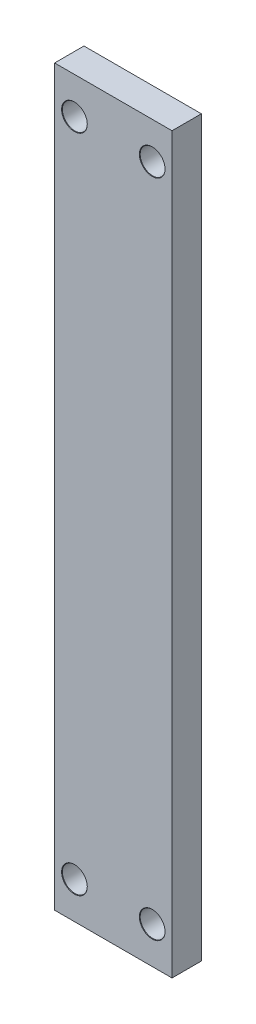
ISO-10303-21;
HEADER;
FILE_DESCRIPTION(('STEP AP214'),'2;1');
FILE_NAME('part.step','',(''),(''),'','','');
FILE_SCHEMA(('AUTOMOTIVE_DESIGN { 1 0 10303 214 1 1 1 1 }'));
ENDSEC;
DATA;
#1=APPLICATION_CONTEXT('core data for automotive mechanical design processes');
#2=APPLICATION_PROTOCOL_DEFINITION('international standard','automotive_design',2000,#1);
#3=PRODUCT_CONTEXT('',#1,'mechanical');
#4=PRODUCT('Part','Part','',(#3));
#5=PRODUCT_RELATED_PRODUCT_CATEGORY('part','',(#4));
#6=PRODUCT_DEFINITION_FORMATION('','',#4);
#7=PRODUCT_DEFINITION_CONTEXT('part definition',#1,'design');
#8=PRODUCT_DEFINITION('design','',#6,#7);
#9=PRODUCT_DEFINITION_SHAPE('','',#8);
#10=(LENGTH_UNIT() NAMED_UNIT(*) SI_UNIT(.MILLI.,.METRE.));
#11=(NAMED_UNIT(*) PLANE_ANGLE_UNIT() SI_UNIT($,.RADIAN.));
#12=(NAMED_UNIT(*) SI_UNIT($,.STERADIAN.) SOLID_ANGLE_UNIT());
#13=UNCERTAINTY_MEASURE_WITH_UNIT(LENGTH_MEASURE(1.E-05),#10,'distance_accuracy_value','');
#14=(GEOMETRIC_REPRESENTATION_CONTEXT(3) GLOBAL_UNCERTAINTY_ASSIGNED_CONTEXT((#13)) GLOBAL_UNIT_ASSIGNED_CONTEXT((#10,
#11,#12)) REPRESENTATION_CONTEXT('',''));
#15=CARTESIAN_POINT('',(0.,0.,0.));
#16=DIRECTION('',(0.,0.,1.));
#17=DIRECTION('',(1.,0.,0.));
#18=AXIS2_PLACEMENT_3D('',#15,#16,#17);
#19=CARTESIAN_POINT('',(0.,0.,2.));
#20=DIRECTION('',(1.,0.,0.));
#21=DIRECTION('',(0.,0.,-1.));
#22=AXIS2_PLACEMENT_3D('',#19,#20,#21);
#23=PLANE('',#22);
#24=DIRECTION('',(0.,-1.,0.));
#25=VECTOR('',#24,1.);
#26=CARTESIAN_POINT('',(0.,0.,0.));
#27=LINE('',#26,#25);
#28=CARTESIAN_POINT('',(0.,50.,0.));
#29=VERTEX_POINT('',#28);
#30=CARTESIAN_POINT('',(0.,0.,0.));
#31=VERTEX_POINT('',#30);
#32=EDGE_CURVE('E102',#29,#31,#27,.T.);
#33=ORIENTED_EDGE('',*,*,#32,.T.);
#34=DIRECTION('',(0.,0.,-1.));
#35=VECTOR('',#34,1.);
#36=CARTESIAN_POINT('',(0.,0.,2.));
#37=LINE('',#36,#35);
#38=CARTESIAN_POINT('',(0.,0.,2.));
#39=VERTEX_POINT('',#38);
#40=EDGE_CURVE('E11',#39,#31,#37,.T.);
#41=ORIENTED_EDGE('',*,*,#40,.F.);
#42=DIRECTION('',(0.,-1.,0.));
#43=VECTOR('',#42,1.);
#44=CARTESIAN_POINT('',(0.,0.,2.));
#45=LINE('',#44,#43);
#46=CARTESIAN_POINT('',(0.,50.,2.));
#47=VERTEX_POINT('',#46);
#48=EDGE_CURVE('E90',#47,#39,#45,.T.);
#49=ORIENTED_EDGE('',*,*,#48,.F.);
#50=DIRECTION('',(0.,0.,-1.));
#51=VECTOR('',#50,1.);
#52=CARTESIAN_POINT('',(0.,50.,2.));
#53=LINE('',#52,#51);
#54=EDGE_CURVE('E98',#47,#29,#53,.T.);
#55=ORIENTED_EDGE('',*,*,#54,.T.);
#56=EDGE_LOOP('',(#33,#41,#49,#55));
#57=FACE_BOUND('',#56,.T.);
#58=ADVANCED_FACE('F39',(#57),#23,.F.);
#59=CARTESIAN_POINT('',(0.,0.,2.));
#60=DIRECTION('',(0.,1.,0.));
#61=DIRECTION('',(0.,0.,1.));
#62=AXIS2_PLACEMENT_3D('',#59,#60,#61);
#63=PLANE('',#62);
#64=DIRECTION('',(1.,0.,0.));
#65=VECTOR('',#64,1.);
#66=CARTESIAN_POINT('',(0.,0.,0.));
#67=LINE('',#66,#65);
#68=CARTESIAN_POINT('',(8.,0.,0.));
#69=VERTEX_POINT('',#68);
#70=EDGE_CURVE('E94',#31,#69,#67,.T.);
#71=ORIENTED_EDGE('',*,*,#70,.T.);
#72=DIRECTION('',(0.,0.,-1.));
#73=VECTOR('',#72,1.);
#74=CARTESIAN_POINT('',(8.,0.,2.));
#75=LINE('',#74,#73);
#76=CARTESIAN_POINT('',(8.,0.,2.));
#77=VERTEX_POINT('',#76);
#78=EDGE_CURVE('E47',#77,#69,#75,.T.);
#79=ORIENTED_EDGE('',*,*,#78,.F.);
#80=DIRECTION('',(1.,0.,0.));
#81=VECTOR('',#80,1.);
#82=CARTESIAN_POINT('',(0.,0.,2.));
#83=LINE('',#82,#81);
#84=EDGE_CURVE('E85',#39,#77,#83,.T.);
#85=ORIENTED_EDGE('',*,*,#84,.F.);
#86=ORIENTED_EDGE('',*,*,#40,.T.);
#87=EDGE_LOOP('',(#71,#79,#85,#86));
#88=FACE_BOUND('',#87,.T.);
#89=ADVANCED_FACE('F93',(#88),#63,.F.);
#90=CARTESIAN_POINT('',(8.,0.,2.));
#91=DIRECTION('',(-1.,0.,0.));
#92=DIRECTION('',(0.,0.,1.));
#93=AXIS2_PLACEMENT_3D('',#90,#91,#92);
#94=PLANE('',#93);
#95=DIRECTION('',(0.,1.,0.));
#96=VECTOR('',#95,1.);
#97=CARTESIAN_POINT('',(8.,0.,0.));
#98=LINE('',#97,#96);
#99=CARTESIAN_POINT('',(8.,50.,0.));
#100=VERTEX_POINT('',#99);
#101=EDGE_CURVE('E72',#69,#100,#98,.T.);
#102=ORIENTED_EDGE('',*,*,#101,.T.);
#103=DIRECTION('',(0.,0.,-1.));
#104=VECTOR('',#103,1.);
#105=CARTESIAN_POINT('',(8.,50.,2.));
#106=LINE('',#105,#104);
#107=CARTESIAN_POINT('',(8.,50.,2.));
#108=VERTEX_POINT('',#107);
#109=EDGE_CURVE('E95',#108,#100,#106,.T.);
#110=ORIENTED_EDGE('',*,*,#109,.F.);
#111=DIRECTION('',(0.,1.,0.));
#112=VECTOR('',#111,1.);
#113=CARTESIAN_POINT('',(8.,0.,2.));
#114=LINE('',#113,#112);
#115=EDGE_CURVE('E88',#77,#108,#114,.T.);
#116=ORIENTED_EDGE('',*,*,#115,.F.);
#117=ORIENTED_EDGE('',*,*,#78,.T.);
#118=EDGE_LOOP('',(#102,#110,#116,#117));
#119=FACE_BOUND('',#118,.T.);
#120=ADVANCED_FACE('F96',(#119),#94,.F.);
#121=CARTESIAN_POINT('',(0.,50.,2.));
#122=DIRECTION('',(0.,-1.,0.));
#123=DIRECTION('',(0.,0.,-1.));
#124=AXIS2_PLACEMENT_3D('',#121,#122,#123);
#125=PLANE('',#124);
#126=DIRECTION('',(-1.,0.,0.));
#127=VECTOR('',#126,1.);
#128=CARTESIAN_POINT('',(0.,50.,0.));
#129=LINE('',#128,#127);
#130=EDGE_CURVE('E78',#100,#29,#129,.T.);
#131=ORIENTED_EDGE('',*,*,#130,.T.);
#132=ORIENTED_EDGE('',*,*,#54,.F.);
#133=DIRECTION('',(-1.,0.,0.));
#134=VECTOR('',#133,1.);
#135=CARTESIAN_POINT('',(0.,50.,2.));
#136=LINE('',#135,#134);
#137=EDGE_CURVE('E55',#108,#47,#136,.T.);
#138=ORIENTED_EDGE('',*,*,#137,.F.);
#139=ORIENTED_EDGE('',*,*,#109,.T.);
#140=EDGE_LOOP('',(#131,#132,#138,#139));
#141=FACE_BOUND('',#140,.T.);
#142=ADVANCED_FACE('F110',(#141),#125,.F.);
#143=CARTESIAN_POINT('',(0.,0.,2.));
#144=DIRECTION('',(0.,0.,-1.));
#145=DIRECTION('',(-1.,0.,0.));
#146=AXIS2_PLACEMENT_3D('',#143,#144,#145);
#147=PLANE('',#146);
#148=CARTESIAN_POINT('',(1.35,2.5,2.));
#149=DIRECTION('',(0.,0.,1.));
#150=DIRECTION('',(1.,0.,0.));
#151=AXIS2_PLACEMENT_3D('',#148,#149,#150);
#152=CIRCLE('',#151,0.875000000000001);
#153=CARTESIAN_POINT('',(2.225,2.5,2.));
#154=VERTEX_POINT('',#153);
#155=EDGE_CURVE('E148',#154,#154,#152,.T.);
#156=ORIENTED_EDGE('',*,*,#155,.F.);
#157=EDGE_LOOP('',(#156));
#158=FACE_BOUND('',#157,.T.);
#159=CARTESIAN_POINT('',(6.65,2.5,2.));
#160=DIRECTION('',(0.,0.,1.));
#161=DIRECTION('',(1.,0.,0.));
#162=AXIS2_PLACEMENT_3D('',#159,#160,#161);
#163=CIRCLE('',#162,0.875000000000001);
#164=CARTESIAN_POINT('',(7.525,2.5,2.));
#165=VERTEX_POINT('',#164);
#166=EDGE_CURVE('E139',#165,#165,#163,.T.);
#167=ORIENTED_EDGE('',*,*,#166,.F.);
#168=EDGE_LOOP('',(#167));
#169=FACE_BOUND('',#168,.T.);
#170=CARTESIAN_POINT('',(1.35,47.5,2.));
#171=DIRECTION('',(0.,0.,1.));
#172=DIRECTION('',(1.,0.,0.));
#173=AXIS2_PLACEMENT_3D('',#170,#171,#172);
#174=CIRCLE('',#173,0.875000000000001);
#175=CARTESIAN_POINT('',(2.225,47.5,2.));
#176=VERTEX_POINT('',#175);
#177=EDGE_CURVE('E130',#176,#176,#174,.T.);
#178=ORIENTED_EDGE('',*,*,#177,.F.);
#179=EDGE_LOOP('',(#178));
#180=FACE_BOUND('',#179,.T.);
#181=CARTESIAN_POINT('',(6.65,47.5,2.));
#182=DIRECTION('',(0.,0.,1.));
#183=DIRECTION('',(1.,0.,0.));
#184=AXIS2_PLACEMENT_3D('',#181,#182,#183);
#185=CIRCLE('',#184,0.875000000000001);
#186=CARTESIAN_POINT('',(7.525,47.5,2.));
#187=VERTEX_POINT('',#186);
#188=EDGE_CURVE('E121',#187,#187,#185,.T.);
#189=ORIENTED_EDGE('',*,*,#188,.F.);
#190=EDGE_LOOP('',(#189));
#191=FACE_BOUND('',#190,.T.);
#192=ORIENTED_EDGE('',*,*,#48,.T.);
#193=ORIENTED_EDGE('',*,*,#84,.T.);
#194=ORIENTED_EDGE('',*,*,#115,.T.);
#195=ORIENTED_EDGE('',*,*,#137,.T.);
#196=EDGE_LOOP('',(#192,#193,#194,#195));
#197=FACE_BOUND('',#196,.T.);
#198=ADVANCED_FACE('F86',(#158,#169,#180,#191,#197),#147,.F.);
#199=CARTESIAN_POINT('',(0.,0.,0.));
#200=DIRECTION('',(0.,0.,-1.));
#201=DIRECTION('',(-1.,0.,0.));
#202=AXIS2_PLACEMENT_3D('',#199,#200,#201);
#203=PLANE('',#202);
#204=CARTESIAN_POINT('',(1.35,2.5,0.));
#205=DIRECTION('',(0.,0.,1.));
#206=DIRECTION('',(1.,0.,0.));
#207=AXIS2_PLACEMENT_3D('',#204,#205,#206);
#208=CIRCLE('',#207,0.849999999999999);
#209=CARTESIAN_POINT('',(2.2,2.5,0.));
#210=VERTEX_POINT('',#209);
#211=EDGE_CURVE('E142',#210,#210,#208,.T.);
#212=ORIENTED_EDGE('',*,*,#211,.T.);
#213=EDGE_LOOP('',(#212));
#214=FACE_BOUND('',#213,.T.);
#215=CARTESIAN_POINT('',(6.65,2.5,0.));
#216=DIRECTION('',(0.,0.,1.));
#217=DIRECTION('',(1.,0.,0.));
#218=AXIS2_PLACEMENT_3D('',#215,#216,#217);
#219=CIRCLE('',#218,0.849999999999999);
#220=CARTESIAN_POINT('',(7.5,2.5,0.));
#221=VERTEX_POINT('',#220);
#222=EDGE_CURVE('E133',#221,#221,#219,.T.);
#223=ORIENTED_EDGE('',*,*,#222,.T.);
#224=EDGE_LOOP('',(#223));
#225=FACE_BOUND('',#224,.T.);
#226=CARTESIAN_POINT('',(1.35,47.5,0.));
#227=DIRECTION('',(0.,0.,1.));
#228=DIRECTION('',(1.,0.,0.));
#229=AXIS2_PLACEMENT_3D('',#226,#227,#228);
#230=CIRCLE('',#229,0.849999999999999);
#231=CARTESIAN_POINT('',(2.2,47.5,0.));
#232=VERTEX_POINT('',#231);
#233=EDGE_CURVE('E124',#232,#232,#230,.T.);
#234=ORIENTED_EDGE('',*,*,#233,.T.);
#235=EDGE_LOOP('',(#234));
#236=FACE_BOUND('',#235,.T.);
#237=CARTESIAN_POINT('',(6.65,47.5,0.));
#238=DIRECTION('',(0.,0.,1.));
#239=DIRECTION('',(1.,0.,0.));
#240=AXIS2_PLACEMENT_3D('',#237,#238,#239);
#241=CIRCLE('',#240,0.849999999999999);
#242=CARTESIAN_POINT('',(7.5,47.5,0.));
#243=VERTEX_POINT('',#242);
#244=EDGE_CURVE('E105',#243,#243,#241,.T.);
#245=ORIENTED_EDGE('',*,*,#244,.T.);
#246=EDGE_LOOP('',(#245));
#247=FACE_BOUND('',#246,.T.);
#248=ORIENTED_EDGE('',*,*,#32,.F.);
#249=ORIENTED_EDGE('',*,*,#130,.F.);
#250=ORIENTED_EDGE('',*,*,#101,.F.);
#251=ORIENTED_EDGE('',*,*,#70,.F.);
#252=EDGE_LOOP('',(#248,#249,#250,#251));
#253=FACE_BOUND('',#252,.T.);
#254=ADVANCED_FACE('F113',(#214,#225,#236,#247,#253),#203,.T.);
#255=CARTESIAN_POINT('',(6.65,47.5,2.));
#256=DIRECTION('',(0.,0.,1.));
#257=DIRECTION('',(1.,0.,0.));
#258=AXIS2_PLACEMENT_3D('',#255,#256,#257);
#259=CYLINDRICAL_SURFACE('',#258,0.849999999999994);
#260=ORIENTED_EDGE('',*,*,#244,.F.);
#261=EDGE_LOOP('',(#260));
#262=FACE_BOUND('',#261,.T.);
#263=CARTESIAN_POINT('',(6.65,47.5,1.97124078981946));
#264=DIRECTION('',(0.,0.,1.));
#265=DIRECTION('',(1.,0.,0.));
#266=AXIS2_PLACEMENT_3D('',#263,#264,#265);
#267=CIRCLE('',#266,0.849999999999988);
#268=CARTESIAN_POINT('',(7.49999999999999,47.5,1.97124078981946));
#269=VERTEX_POINT('',#268);
#270=EDGE_CURVE('E118',#269,#269,#267,.T.);
#271=ORIENTED_EDGE('',*,*,#270,.T.);
#272=EDGE_LOOP('',(#271));
#273=FACE_BOUND('',#272,.T.);
#274=ADVANCED_FACE('F166',(#262,#273),#259,.F.);
#275=CARTESIAN_POINT('',(6.65,47.5,2.));
#276=DIRECTION('',(0.,0.,1.));
#277=DIRECTION('',(1.,0.,0.));
#278=AXIS2_PLACEMENT_3D('',#275,#276,#277);
#279=CONICAL_SURFACE('',#278,0.875000000000001,0.715584993317597);
#280=ORIENTED_EDGE('',*,*,#270,.F.);
#281=EDGE_LOOP('',(#280));
#282=FACE_BOUND('',#281,.T.);
#283=ORIENTED_EDGE('',*,*,#188,.T.);
#284=EDGE_LOOP('',(#283));
#285=FACE_BOUND('',#284,.T.);
#286=ADVANCED_FACE('F163',(#282,#285),#279,.F.);
#287=CARTESIAN_POINT('',(1.35,47.5,2.));
#288=DIRECTION('',(0.,0.,1.));
#289=DIRECTION('',(1.,0.,0.));
#290=AXIS2_PLACEMENT_3D('',#287,#288,#289);
#291=CYLINDRICAL_SURFACE('',#290,0.849999999999994);
#292=ORIENTED_EDGE('',*,*,#233,.F.);
#293=EDGE_LOOP('',(#292));
#294=FACE_BOUND('',#293,.T.);
#295=CARTESIAN_POINT('',(1.35,47.5,1.97124078981946));
#296=DIRECTION('',(0.,0.,1.));
#297=DIRECTION('',(1.,0.,0.));
#298=AXIS2_PLACEMENT_3D('',#295,#296,#297);
#299=CIRCLE('',#298,0.849999999999988);
#300=CARTESIAN_POINT('',(2.19999999999999,47.5,1.97124078981946));
#301=VERTEX_POINT('',#300);
#302=EDGE_CURVE('E127',#301,#301,#299,.T.);
#303=ORIENTED_EDGE('',*,*,#302,.T.);
#304=EDGE_LOOP('',(#303));
#305=FACE_BOUND('',#304,.T.);
#306=ADVANCED_FACE('F165',(#294,#305),#291,.F.);
#307=CARTESIAN_POINT('',(1.35,47.5,2.));
#308=DIRECTION('',(0.,0.,1.));
#309=DIRECTION('',(1.,0.,0.));
#310=AXIS2_PLACEMENT_3D('',#307,#308,#309);
#311=CONICAL_SURFACE('',#310,0.875000000000001,0.715584993317597);
#312=ORIENTED_EDGE('',*,*,#302,.F.);
#313=EDGE_LOOP('',(#312));
#314=FACE_BOUND('',#313,.T.);
#315=ORIENTED_EDGE('',*,*,#177,.T.);
#316=EDGE_LOOP('',(#315));
#317=FACE_BOUND('',#316,.T.);
#318=ADVANCED_FACE('F173',(#314,#317),#311,.F.);
#319=CARTESIAN_POINT('',(6.65,2.5,2.));
#320=DIRECTION('',(0.,0.,1.));
#321=DIRECTION('',(1.,0.,0.));
#322=AXIS2_PLACEMENT_3D('',#319,#320,#321);
#323=CYLINDRICAL_SURFACE('',#322,0.849999999999994);
#324=ORIENTED_EDGE('',*,*,#222,.F.);
#325=EDGE_LOOP('',(#324));
#326=FACE_BOUND('',#325,.T.);
#327=CARTESIAN_POINT('',(6.65,2.5,1.97124078981946));
#328=DIRECTION('',(0.,0.,1.));
#329=DIRECTION('',(1.,0.,0.));
#330=AXIS2_PLACEMENT_3D('',#327,#328,#329);
#331=CIRCLE('',#330,0.849999999999988);
#332=CARTESIAN_POINT('',(7.49999999999999,2.5,1.97124078981946));
#333=VERTEX_POINT('',#332);
#334=EDGE_CURVE('E136',#333,#333,#331,.T.);
#335=ORIENTED_EDGE('',*,*,#334,.T.);
#336=EDGE_LOOP('',(#335));
#337=FACE_BOUND('',#336,.T.);
#338=ADVANCED_FACE('F208',(#326,#337),#323,.F.);
#339=CARTESIAN_POINT('',(6.65,2.5,2.));
#340=DIRECTION('',(0.,0.,1.));
#341=DIRECTION('',(1.,0.,0.));
#342=AXIS2_PLACEMENT_3D('',#339,#340,#341);
#343=CONICAL_SURFACE('',#342,0.875000000000001,0.715584993317597);
#344=ORIENTED_EDGE('',*,*,#334,.F.);
#345=EDGE_LOOP('',(#344));
#346=FACE_BOUND('',#345,.T.);
#347=ORIENTED_EDGE('',*,*,#166,.T.);
#348=EDGE_LOOP('',(#347));
#349=FACE_BOUND('',#348,.T.);
#350=ADVANCED_FACE('F212',(#346,#349),#343,.F.);
#351=CARTESIAN_POINT('',(1.35,2.5,2.));
#352=DIRECTION('',(0.,0.,1.));
#353=DIRECTION('',(1.,0.,0.));
#354=AXIS2_PLACEMENT_3D('',#351,#352,#353);
#355=CYLINDRICAL_SURFACE('',#354,0.849999999999994);
#356=ORIENTED_EDGE('',*,*,#211,.F.);
#357=EDGE_LOOP('',(#356));
#358=FACE_BOUND('',#357,.T.);
#359=CARTESIAN_POINT('',(1.35,2.5,1.97124078981946));
#360=DIRECTION('',(0.,0.,1.));
#361=DIRECTION('',(1.,0.,0.));
#362=AXIS2_PLACEMENT_3D('',#359,#360,#361);
#363=CIRCLE('',#362,0.849999999999988);
#364=CARTESIAN_POINT('',(2.19999999999999,2.5,1.97124078981946));
#365=VERTEX_POINT('',#364);
#366=EDGE_CURVE('E145',#365,#365,#363,.T.);
#367=ORIENTED_EDGE('',*,*,#366,.T.);
#368=EDGE_LOOP('',(#367));
#369=FACE_BOUND('',#368,.T.);
#370=ADVANCED_FACE('F218',(#358,#369),#355,.F.);
#371=CARTESIAN_POINT('',(1.35,2.5,2.));
#372=DIRECTION('',(0.,0.,1.));
#373=DIRECTION('',(1.,0.,0.));
#374=AXIS2_PLACEMENT_3D('',#371,#372,#373);
#375=CONICAL_SURFACE('',#374,0.875000000000001,0.715584993317597);
#376=ORIENTED_EDGE('',*,*,#366,.F.);
#377=EDGE_LOOP('',(#376));
#378=FACE_BOUND('',#377,.T.);
#379=ORIENTED_EDGE('',*,*,#155,.T.);
#380=EDGE_LOOP('',(#379));
#381=FACE_BOUND('',#380,.T.);
#382=ADVANCED_FACE('F152',(#378,#381),#375,.F.);
#383=CLOSED_SHELL('',(#58,#89,#120,#142,#198,#254,#274,#286,#306,#318,#338,#350,#370,#382));
#384=MANIFOLD_SOLID_BREP('B2',#383);
#385=ADVANCED_BREP_SHAPE_REPRESENTATION('',(#18,#384),#14);
#386=SHAPE_DEFINITION_REPRESENTATION(#9,#385);
ENDSEC;
END-ISO-10303-21;
